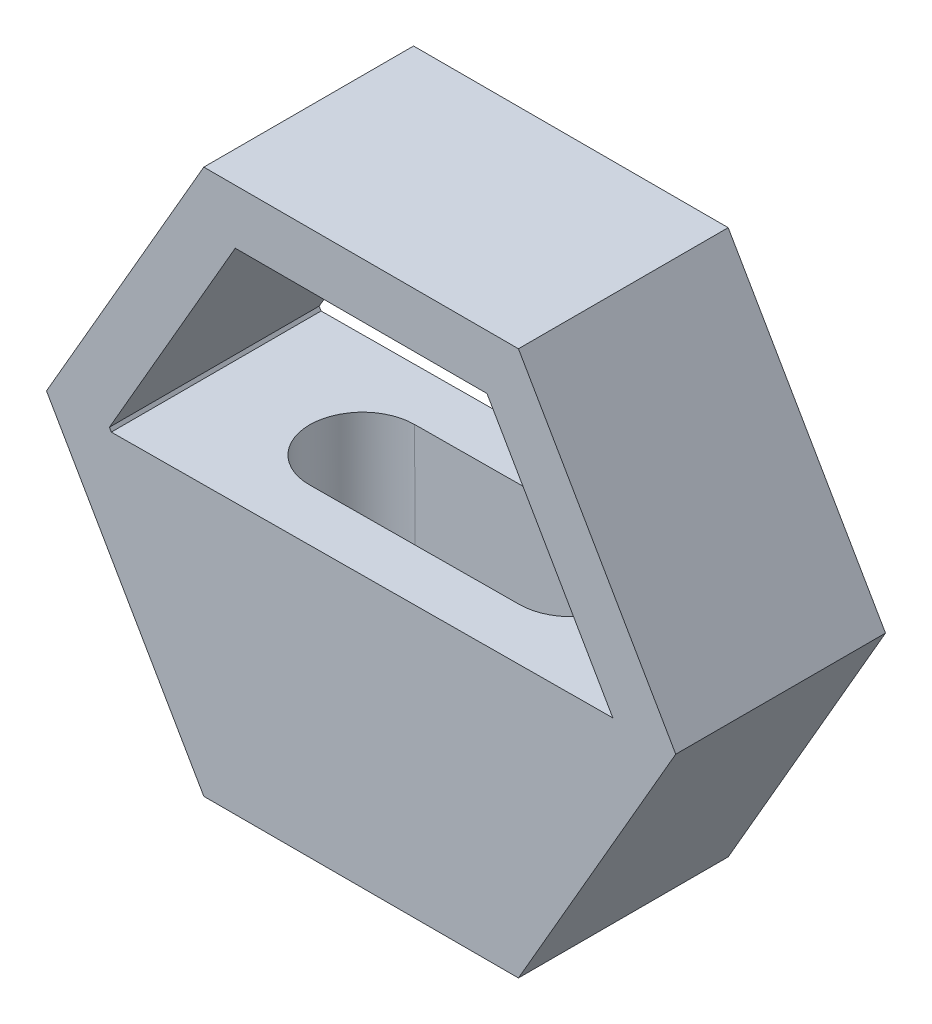
ISO-10303-21;
HEADER;
FILE_DESCRIPTION(('STEP AP214'),'2;1');
FILE_NAME('part.step','',(''),(''),'','','');
FILE_SCHEMA(('AUTOMOTIVE_DESIGN { 1 0 10303 214 1 1 1 1 }'));
ENDSEC;
DATA;
#1=APPLICATION_CONTEXT('core data for automotive mechanical design processes');
#2=APPLICATION_PROTOCOL_DEFINITION('international standard','automotive_design',2000,#1);
#3=PRODUCT_CONTEXT('',#1,'mechanical');
#4=PRODUCT('Part','Part','',(#3));
#5=PRODUCT_RELATED_PRODUCT_CATEGORY('part','',(#4));
#6=PRODUCT_DEFINITION_FORMATION('','',#4);
#7=PRODUCT_DEFINITION_CONTEXT('part definition',#1,'design');
#8=PRODUCT_DEFINITION('design','',#6,#7);
#9=PRODUCT_DEFINITION_SHAPE('','',#8);
#10=(LENGTH_UNIT() NAMED_UNIT(*) SI_UNIT(.MILLI.,.METRE.));
#11=(NAMED_UNIT(*) PLANE_ANGLE_UNIT() SI_UNIT($,.RADIAN.));
#12=(NAMED_UNIT(*) SI_UNIT($,.STERADIAN.) SOLID_ANGLE_UNIT());
#13=UNCERTAINTY_MEASURE_WITH_UNIT(LENGTH_MEASURE(1.E-05),#10,'distance_accuracy_value','');
#14=(GEOMETRIC_REPRESENTATION_CONTEXT(3) GLOBAL_UNCERTAINTY_ASSIGNED_CONTEXT((#13)) GLOBAL_UNIT_ASSIGNED_CONTEXT((#10,
#11,#12)) REPRESENTATION_CONTEXT('',''));
#15=CARTESIAN_POINT('',(0.,0.,0.));
#16=DIRECTION('',(0.,0.,1.));
#17=DIRECTION('',(1.,0.,0.));
#18=AXIS2_PLACEMENT_3D('',#15,#16,#17);
#19=CARTESIAN_POINT('',(75.,-129.903810567666,-100.));
#20=DIRECTION('',(0.866025403784439,-0.5,0.));
#21=DIRECTION('',(0.5,0.866025403784439,0.));
#22=AXIS2_PLACEMENT_3D('',#19,#20,#21);
#23=PLANE('',#22);
#24=DIRECTION('',(0.5,0.866025403784439,0.));
#25=VECTOR('',#24,1.);
#26=CARTESIAN_POINT('',(75.,-129.903810567666,0.));
#27=LINE('',#26,#25);
#28=CARTESIAN_POINT('',(75.,-129.903810567666,0.));
#29=VERTEX_POINT('',#28);
#30=CARTESIAN_POINT('',(150.,0.,0.));
#31=VERTEX_POINT('',#30);
#32=EDGE_CURVE('E208',#29,#31,#27,.T.);
#33=ORIENTED_EDGE('',*,*,#32,.F.);
#34=DIRECTION('',(0.,0.,1.));
#35=VECTOR('',#34,1.);
#36=CARTESIAN_POINT('',(75.,-129.903810567666,-100.));
#37=LINE('',#36,#35);
#38=CARTESIAN_POINT('',(75.,-129.903810567666,-100.));
#39=VERTEX_POINT('',#38);
#40=EDGE_CURVE('E11',#39,#29,#37,.T.);
#41=ORIENTED_EDGE('',*,*,#40,.F.);
#42=DIRECTION('',(0.5,0.866025403784439,0.));
#43=VECTOR('',#42,1.);
#44=CARTESIAN_POINT('',(75.,-129.903810567666,-100.));
#45=LINE('',#44,#43);
#46=CARTESIAN_POINT('',(150.,0.,-100.));
#47=VERTEX_POINT('',#46);
#48=EDGE_CURVE('E217',#39,#47,#45,.T.);
#49=ORIENTED_EDGE('',*,*,#48,.T.);
#50=DIRECTION('',(0.,0.,1.));
#51=VECTOR('',#50,1.);
#52=CARTESIAN_POINT('',(150.,0.,-100.));
#53=LINE('',#52,#51);
#54=EDGE_CURVE('E36',#47,#31,#53,.T.);
#55=ORIENTED_EDGE('',*,*,#54,.T.);
#56=EDGE_LOOP('',(#33,#41,#49,#55));
#57=FACE_BOUND('',#56,.T.);
#58=ADVANCED_FACE('F33',(#57),#23,.T.);
#59=CARTESIAN_POINT('',(-75.0000000000001,-129.903810567666,-100.));
#60=DIRECTION('',(0.,-1.,0.));
#61=DIRECTION('',(1.,0.,0.));
#62=AXIS2_PLACEMENT_3D('',#59,#60,#61);
#63=PLANE('',#62);
#64=DIRECTION('',(1.,0.,0.));
#65=VECTOR('',#64,1.);
#66=CARTESIAN_POINT('',(-75.0000000000001,-129.903810567666,0.));
#67=LINE('',#66,#65);
#68=CARTESIAN_POINT('',(-75.0000000000001,-129.903810567666,0.));
#69=VERTEX_POINT('',#68);
#70=EDGE_CURVE('E221',#69,#29,#67,.T.);
#71=ORIENTED_EDGE('',*,*,#70,.F.);
#72=DIRECTION('',(0.,0.,1.));
#73=VECTOR('',#72,1.);
#74=CARTESIAN_POINT('',(-75.0000000000001,-129.903810567666,-100.));
#75=LINE('',#74,#73);
#76=CARTESIAN_POINT('',(-75.0000000000001,-129.903810567666,-100.));
#77=VERTEX_POINT('',#76);
#78=EDGE_CURVE('E41',#77,#69,#75,.T.);
#79=ORIENTED_EDGE('',*,*,#78,.F.);
#80=DIRECTION('',(1.,0.,0.));
#81=VECTOR('',#80,1.);
#82=CARTESIAN_POINT('',(-75.0000000000001,-129.903810567666,-100.));
#83=LINE('',#82,#81);
#84=EDGE_CURVE('E233',#77,#39,#83,.T.);
#85=ORIENTED_EDGE('',*,*,#84,.T.);
#86=ORIENTED_EDGE('',*,*,#40,.T.);
#87=EDGE_LOOP('',(#71,#79,#85,#86));
#88=FACE_BOUND('',#87,.T.);
#89=ADVANCED_FACE('F270',(#88),#63,.T.);
#90=CARTESIAN_POINT('',(-150.,0.,-100.));
#91=DIRECTION('',(-0.866025403784439,-0.5,0.));
#92=DIRECTION('',(0.5,-0.866025403784439,0.));
#93=AXIS2_PLACEMENT_3D('',#90,#91,#92);
#94=PLANE('',#93);
#95=DIRECTION('',(0.5,-0.866025403784439,0.));
#96=VECTOR('',#95,1.);
#97=CARTESIAN_POINT('',(-150.,0.,0.));
#98=LINE('',#97,#96);
#99=CARTESIAN_POINT('',(-150.,0.,0.));
#100=VERTEX_POINT('',#99);
#101=EDGE_CURVE('E247',#100,#69,#98,.T.);
#102=ORIENTED_EDGE('',*,*,#101,.F.);
#103=DIRECTION('',(0.,0.,1.));
#104=VECTOR('',#103,1.);
#105=CARTESIAN_POINT('',(-150.,0.,-100.));
#106=LINE('',#105,#104);
#107=CARTESIAN_POINT('',(-150.,0.,-100.));
#108=VERTEX_POINT('',#107);
#109=EDGE_CURVE('E253',#108,#100,#106,.T.);
#110=ORIENTED_EDGE('',*,*,#109,.F.);
#111=DIRECTION('',(0.5,-0.866025403784439,0.));
#112=VECTOR('',#111,1.);
#113=CARTESIAN_POINT('',(-150.,0.,-100.));
#114=LINE('',#113,#112);
#115=EDGE_CURVE('E230',#108,#77,#114,.T.);
#116=ORIENTED_EDGE('',*,*,#115,.T.);
#117=ORIENTED_EDGE('',*,*,#78,.T.);
#118=EDGE_LOOP('',(#102,#110,#116,#117));
#119=FACE_BOUND('',#118,.T.);
#120=ADVANCED_FACE('F283',(#119),#94,.T.);
#121=CARTESIAN_POINT('',(-75.,129.903810567666,-100.));
#122=DIRECTION('',(-0.866025403784439,0.5,0.));
#123=DIRECTION('',(-0.5,-0.866025403784439,0.));
#124=AXIS2_PLACEMENT_3D('',#121,#122,#123);
#125=PLANE('',#124);
#126=DIRECTION('',(-0.5,-0.866025403784439,0.));
#127=VECTOR('',#126,1.);
#128=CARTESIAN_POINT('',(-75.,129.903810567666,0.));
#129=LINE('',#128,#127);
#130=CARTESIAN_POINT('',(-75.,129.903810567666,0.));
#131=VERTEX_POINT('',#130);
#132=EDGE_CURVE('E244',#131,#100,#129,.T.);
#133=ORIENTED_EDGE('',*,*,#132,.F.);
#134=DIRECTION('',(0.,0.,1.));
#135=VECTOR('',#134,1.);
#136=CARTESIAN_POINT('',(-75.,129.903810567666,-100.));
#137=LINE('',#136,#135);
#138=CARTESIAN_POINT('',(-75.,129.903810567666,-100.));
#139=VERTEX_POINT('',#138);
#140=EDGE_CURVE('E255',#139,#131,#137,.T.);
#141=ORIENTED_EDGE('',*,*,#140,.F.);
#142=DIRECTION('',(-0.5,-0.866025403784439,0.));
#143=VECTOR('',#142,1.);
#144=CARTESIAN_POINT('',(-75.,129.903810567666,-100.));
#145=LINE('',#144,#143);
#146=EDGE_CURVE('E227',#139,#108,#145,.T.);
#147=ORIENTED_EDGE('',*,*,#146,.T.);
#148=ORIENTED_EDGE('',*,*,#109,.T.);
#149=EDGE_LOOP('',(#133,#141,#147,#148));
#150=FACE_BOUND('',#149,.T.);
#151=ADVANCED_FACE('F281',(#150),#125,.T.);
#152=CARTESIAN_POINT('',(75.,129.903810567666,-100.));
#153=DIRECTION('',(0.,1.,0.));
#154=DIRECTION('',(0.,0.,1.));
#155=AXIS2_PLACEMENT_3D('',#152,#153,#154);
#156=PLANE('',#155);
#157=DIRECTION('',(-1.,0.,0.));
#158=VECTOR('',#157,1.);
#159=CARTESIAN_POINT('',(75.,129.903810567666,0.));
#160=LINE('',#159,#158);
#161=CARTESIAN_POINT('',(75.,129.903810567666,0.));
#162=VERTEX_POINT('',#161);
#163=EDGE_CURVE('E241',#162,#131,#160,.T.);
#164=ORIENTED_EDGE('',*,*,#163,.F.);
#165=DIRECTION('',(0.,0.,1.));
#166=VECTOR('',#165,1.);
#167=CARTESIAN_POINT('',(75.,129.903810567666,-100.));
#168=LINE('',#167,#166);
#169=CARTESIAN_POINT('',(75.,129.903810567666,-100.));
#170=VERTEX_POINT('',#169);
#171=EDGE_CURVE('E256',#170,#162,#168,.T.);
#172=ORIENTED_EDGE('',*,*,#171,.F.);
#173=DIRECTION('',(-1.,0.,0.));
#174=VECTOR('',#173,1.);
#175=CARTESIAN_POINT('',(75.,129.903810567666,-100.));
#176=LINE('',#175,#174);
#177=EDGE_CURVE('E224',#170,#139,#176,.T.);
#178=ORIENTED_EDGE('',*,*,#177,.T.);
#179=ORIENTED_EDGE('',*,*,#140,.T.);
#180=EDGE_LOOP('',(#164,#172,#178,#179));
#181=FACE_BOUND('',#180,.T.);
#182=ADVANCED_FACE('F278',(#181),#156,.T.);
#183=CARTESIAN_POINT('',(150.,0.,-100.));
#184=DIRECTION('',(0.866025403784438,0.5,0.));
#185=DIRECTION('',(-0.5,0.866025403784439,0.));
#186=AXIS2_PLACEMENT_3D('',#183,#184,#185);
#187=PLANE('',#186);
#188=DIRECTION('',(-0.5,0.866025403784438,0.));
#189=VECTOR('',#188,1.);
#190=CARTESIAN_POINT('',(150.,0.,0.));
#191=LINE('',#190,#189);
#192=EDGE_CURVE('E238',#31,#162,#191,.T.);
#193=ORIENTED_EDGE('',*,*,#192,.F.);
#194=ORIENTED_EDGE('',*,*,#54,.F.);
#195=DIRECTION('',(-0.5,0.866025403784438,0.));
#196=VECTOR('',#195,1.);
#197=CARTESIAN_POINT('',(150.,0.,-100.));
#198=LINE('',#197,#196);
#199=EDGE_CURVE('E220',#47,#170,#198,.T.);
#200=ORIENTED_EDGE('',*,*,#199,.T.);
#201=ORIENTED_EDGE('',*,*,#171,.T.);
#202=EDGE_LOOP('',(#193,#194,#200,#201));
#203=FACE_BOUND('',#202,.T.);
#204=ADVANCED_FACE('F264',(#203),#187,.T.);
#205=CARTESIAN_POINT('',(0.,0.,-100.));
#206=DIRECTION('',(0.,0.,1.));
#207=DIRECTION('',(1.,0.,0.));
#208=AXIS2_PLACEMENT_3D('',#205,#206,#207);
#209=PLANE('',#208);
#210=DIRECTION('',(-1.,0.,0.));
#211=VECTOR('',#210,1.);
#212=CARTESIAN_POINT('',(0.,103.923048454133,-100.));
#213=LINE('',#212,#211);
#214=CARTESIAN_POINT('',(60.,103.923048454133,-100.));
#215=VERTEX_POINT('',#214);
#216=CARTESIAN_POINT('',(-60.,103.923048454133,-100.));
#217=VERTEX_POINT('',#216);
#218=EDGE_CURVE('E190',#215,#217,#213,.T.);
#219=ORIENTED_EDGE('',*,*,#218,.T.);
#220=DIRECTION('',(-0.5,-0.866025403784439,0.));
#221=VECTOR('',#220,1.);
#222=CARTESIAN_POINT('',(-90.0000000000001,51.9615242270663,-100.));
#223=LINE('',#222,#221);
#224=CARTESIAN_POINT('',(-120.,0.,-100.));
#225=VERTEX_POINT('',#224);
#226=EDGE_CURVE('E179',#217,#225,#223,.T.);
#227=ORIENTED_EDGE('',*,*,#226,.T.);
#228=DIRECTION('',(0.5,-0.866025403784439,0.));
#229=VECTOR('',#228,1.);
#230=CARTESIAN_POINT('',(-90.,-51.9615242270664,-100.));
#231=LINE('',#230,#229);
#232=CARTESIAN_POINT('',(-119.097636783105,-1.56293893854325,-100.));
#233=VERTEX_POINT('',#232);
#234=EDGE_CURVE('E182',#225,#233,#231,.T.);
#235=ORIENTED_EDGE('',*,*,#234,.T.);
#236=DIRECTION('',(0.99997863565701,0.00653668337507449,0.));
#237=VECTOR('',#236,1.);
#238=CARTESIAN_POINT('',(0.00512738754551685,-0.784385246775434,-100.));
#239=LINE('',#238,#237);
#240=CARTESIAN_POINT('',(120.,0.,-100.));
#241=VERTEX_POINT('',#240);
#242=EDGE_CURVE('E57',#233,#241,#239,.T.);
#243=ORIENTED_EDGE('',*,*,#242,.T.);
#244=DIRECTION('',(-0.5,0.866025403784439,0.));
#245=VECTOR('',#244,1.);
#246=CARTESIAN_POINT('',(90.,51.9615242270663,-100.));
#247=LINE('',#246,#245);
#248=EDGE_CURVE('E187',#241,#215,#247,.T.);
#249=ORIENTED_EDGE('',*,*,#248,.T.);
#250=EDGE_LOOP('',(#219,#227,#235,#243,#249));
#251=FACE_BOUND('',#250,.T.);
#252=ORIENTED_EDGE('',*,*,#48,.F.);
#253=ORIENTED_EDGE('',*,*,#84,.F.);
#254=ORIENTED_EDGE('',*,*,#115,.F.);
#255=ORIENTED_EDGE('',*,*,#146,.F.);
#256=ORIENTED_EDGE('',*,*,#177,.F.);
#257=ORIENTED_EDGE('',*,*,#199,.F.);
#258=EDGE_LOOP('',(#252,#253,#254,#255,#256,#257));
#259=FACE_BOUND('',#258,.T.);
#260=ADVANCED_FACE('F273',(#251,#259),#209,.F.);
#261=CARTESIAN_POINT('',(0.,0.,0.));
#262=DIRECTION('',(0.,0.,1.));
#263=DIRECTION('',(1.,0.,0.));
#264=AXIS2_PLACEMENT_3D('',#261,#262,#263);
#265=PLANE('',#264);
#266=DIRECTION('',(-0.5,-0.866025403784439,0.));
#267=VECTOR('',#266,1.);
#268=CARTESIAN_POINT('',(-90.0000000000001,51.9615242270663,0.));
#269=LINE('',#268,#267);
#270=CARTESIAN_POINT('',(-60.,103.923048454133,0.));
#271=VERTEX_POINT('',#270);
#272=CARTESIAN_POINT('',(-120.,0.,0.));
#273=VERTEX_POINT('',#272);
#274=EDGE_CURVE('E175',#271,#273,#269,.T.);
#275=ORIENTED_EDGE('',*,*,#274,.F.);
#276=DIRECTION('',(-1.,0.,0.));
#277=VECTOR('',#276,1.);
#278=CARTESIAN_POINT('',(0.,103.923048454133,0.));
#279=LINE('',#278,#277);
#280=CARTESIAN_POINT('',(60.,103.923048454133,0.));
#281=VERTEX_POINT('',#280);
#282=EDGE_CURVE('E183',#281,#271,#279,.T.);
#283=ORIENTED_EDGE('',*,*,#282,.F.);
#284=DIRECTION('',(-0.5,0.866025403784439,0.));
#285=VECTOR('',#284,1.);
#286=CARTESIAN_POINT('',(90.,51.9615242270663,0.));
#287=LINE('',#286,#285);
#288=CARTESIAN_POINT('',(120.,0.,0.));
#289=VERTEX_POINT('',#288);
#290=EDGE_CURVE('E201',#289,#281,#287,.T.);
#291=ORIENTED_EDGE('',*,*,#290,.F.);
#292=DIRECTION('',(0.99997863565701,0.00653668337507449,0.));
#293=VECTOR('',#292,1.);
#294=CARTESIAN_POINT('',(0.00512738754551685,-0.784385246775434,0.));
#295=LINE('',#294,#293);
#296=CARTESIAN_POINT('',(-119.097636783105,-1.56293893854325,0.));
#297=VERTEX_POINT('',#296);
#298=EDGE_CURVE('E198',#297,#289,#295,.T.);
#299=ORIENTED_EDGE('',*,*,#298,.F.);
#300=DIRECTION('',(0.5,-0.866025403784439,0.));
#301=VECTOR('',#300,1.);
#302=CARTESIAN_POINT('',(-90.,-51.9615242270664,0.));
#303=LINE('',#302,#301);
#304=EDGE_CURVE('E195',#273,#297,#303,.T.);
#305=ORIENTED_EDGE('',*,*,#304,.F.);
#306=EDGE_LOOP('',(#275,#283,#291,#299,#305));
#307=FACE_BOUND('',#306,.T.);
#308=ORIENTED_EDGE('',*,*,#32,.T.);
#309=ORIENTED_EDGE('',*,*,#192,.T.);
#310=ORIENTED_EDGE('',*,*,#163,.T.);
#311=ORIENTED_EDGE('',*,*,#132,.T.);
#312=ORIENTED_EDGE('',*,*,#101,.T.);
#313=ORIENTED_EDGE('',*,*,#70,.T.);
#314=EDGE_LOOP('',(#308,#309,#310,#311,#312,#313));
#315=FACE_BOUND('',#314,.T.);
#316=ADVANCED_FACE('F266',(#307,#315),#265,.T.);
#317=CARTESIAN_POINT('',(-90.0000000000001,51.9615242270663,-100.));
#318=DIRECTION('',(-0.866025403784439,0.5,0.));
#319=DIRECTION('',(-0.5,-0.866025403784439,0.));
#320=AXIS2_PLACEMENT_3D('',#317,#318,#319);
#321=PLANE('',#320);
#322=ORIENTED_EDGE('',*,*,#274,.T.);
#323=DIRECTION('',(0.,0.,1.));
#324=VECTOR('',#323,1.);
#325=CARTESIAN_POINT('',(-120.,0.,-100.));
#326=LINE('',#325,#324);
#327=EDGE_CURVE('E193',#225,#273,#326,.T.);
#328=ORIENTED_EDGE('',*,*,#327,.F.);
#329=ORIENTED_EDGE('',*,*,#226,.F.);
#330=DIRECTION('',(0.,0.,1.));
#331=VECTOR('',#330,1.);
#332=CARTESIAN_POINT('',(-60.,103.923048454133,-100.));
#333=LINE('',#332,#331);
#334=EDGE_CURVE('E206',#217,#271,#333,.T.);
#335=ORIENTED_EDGE('',*,*,#334,.T.);
#336=EDGE_LOOP('',(#322,#328,#329,#335));
#337=FACE_BOUND('',#336,.T.);
#338=ADVANCED_FACE('F342',(#337),#321,.F.);
#339=CARTESIAN_POINT('',(0.,103.923048454133,-100.));
#340=DIRECTION('',(0.,1.,0.));
#341=DIRECTION('',(0.,0.,1.));
#342=AXIS2_PLACEMENT_3D('',#339,#340,#341);
#343=PLANE('',#342);
#344=ORIENTED_EDGE('',*,*,#282,.T.);
#345=ORIENTED_EDGE('',*,*,#334,.F.);
#346=ORIENTED_EDGE('',*,*,#218,.F.);
#347=DIRECTION('',(0.,0.,1.));
#348=VECTOR('',#347,1.);
#349=CARTESIAN_POINT('',(60.,103.923048454133,-100.));
#350=LINE('',#349,#348);
#351=EDGE_CURVE('E209',#215,#281,#350,.T.);
#352=ORIENTED_EDGE('',*,*,#351,.T.);
#353=EDGE_LOOP('',(#344,#345,#346,#352));
#354=FACE_BOUND('',#353,.T.);
#355=ADVANCED_FACE('F352',(#354),#343,.F.);
#356=CARTESIAN_POINT('',(90.,51.9615242270663,-100.));
#357=DIRECTION('',(0.866025403784439,0.5,0.));
#358=DIRECTION('',(-0.5,0.866025403784439,0.));
#359=AXIS2_PLACEMENT_3D('',#356,#357,#358);
#360=PLANE('',#359);
#361=ORIENTED_EDGE('',*,*,#290,.T.);
#362=ORIENTED_EDGE('',*,*,#351,.F.);
#363=ORIENTED_EDGE('',*,*,#248,.F.);
#364=DIRECTION('',(0.,0.,1.));
#365=VECTOR('',#364,1.);
#366=CARTESIAN_POINT('',(120.,0.,-100.));
#367=LINE('',#366,#365);
#368=EDGE_CURVE('E211',#241,#289,#367,.T.);
#369=ORIENTED_EDGE('',*,*,#368,.T.);
#370=EDGE_LOOP('',(#361,#362,#363,#369));
#371=FACE_BOUND('',#370,.T.);
#372=ADVANCED_FACE('F362',(#371),#360,.F.);
#373=CARTESIAN_POINT('',(0.00512738754551685,-0.784385246775434,-100.));
#374=DIRECTION('',(0.0065366833750745,-0.99997863565701,0.));
#375=DIRECTION('',(0.99997863565701,0.0065366833750745,0.));
#376=AXIS2_PLACEMENT_3D('',#373,#374,#375);
#377=PLANE('',#376);
#378=CARTESIAN_POINT('',(-49.5477501744031,-1.10830363802534,-50.));
#379=DIRECTION('',(-0.0065366833750745,0.99997863565701,0.));
#380=DIRECTION('',(-0.99997863565701,-0.0065366833750745,0.));
#381=AXIS2_PLACEMENT_3D('',#378,#379,#380);
#382=CIRCLE('',#381,25.);
#383=CARTESIAN_POINT('',(-49.5477501744031,-1.10830363802533,-75.));
#384=VERTEX_POINT('',#383);
#385=CARTESIAN_POINT('',(-49.5477501744031,-1.10830363802534,-25.));
#386=VERTEX_POINT('',#385);
#387=EDGE_CURVE('E169',#384,#386,#382,.T.);
#388=ORIENTED_EDGE('',*,*,#387,.F.);
#389=DIRECTION('',(-0.99997863565701,-0.0065366833750745,0.));
#390=VECTOR('',#389,1.);
#391=CARTESIAN_POINT('',(0.00512738754551686,-0.784385246775435,-75.));
#392=LINE('',#391,#390);
#393=CARTESIAN_POINT('',(50.4501133912979,-0.454635300517888,-75.));
#394=VERTEX_POINT('',#393);
#395=EDGE_CURVE('E49',#394,#384,#392,.T.);
#396=ORIENTED_EDGE('',*,*,#395,.F.);
#397=CARTESIAN_POINT('',(50.4501133912979,-0.454635300517888,-50.));
#398=DIRECTION('',(-0.0065366833750745,0.99997863565701,0.));
#399=DIRECTION('',(-0.99997863565701,-0.0065366833750745,0.));
#400=AXIS2_PLACEMENT_3D('',#397,#398,#399);
#401=CIRCLE('',#400,25.);
#402=CARTESIAN_POINT('',(50.4501133912979,-0.454635300517888,-25.));
#403=VERTEX_POINT('',#402);
#404=EDGE_CURVE('E160',#403,#394,#401,.T.);
#405=ORIENTED_EDGE('',*,*,#404,.F.);
#406=DIRECTION('',(-0.99997863565701,-0.0065366833750745,0.));
#407=VECTOR('',#406,1.);
#408=CARTESIAN_POINT('',(0.00512738754551339,-0.784385246775434,-25.));
#409=LINE('',#408,#407);
#410=EDGE_CURVE('E163',#403,#386,#409,.T.);
#411=ORIENTED_EDGE('',*,*,#410,.T.);
#412=EDGE_LOOP('',(#388,#396,#405,#411));
#413=FACE_BOUND('',#412,.T.);
#414=ORIENTED_EDGE('',*,*,#298,.T.);
#415=ORIENTED_EDGE('',*,*,#368,.F.);
#416=ORIENTED_EDGE('',*,*,#242,.F.);
#417=DIRECTION('',(0.,0.,1.));
#418=VECTOR('',#417,1.);
#419=CARTESIAN_POINT('',(-119.097636783105,-1.56293893854325,-100.));
#420=LINE('',#419,#418);
#421=EDGE_CURVE('E213',#233,#297,#420,.T.);
#422=ORIENTED_EDGE('',*,*,#421,.T.);
#423=EDGE_LOOP('',(#414,#415,#416,#422));
#424=FACE_BOUND('',#423,.T.);
#425=ADVANCED_FACE('F372',(#413,#424),#377,.F.);
#426=CARTESIAN_POINT('',(-90.,-51.9615242270664,-100.));
#427=DIRECTION('',(-0.866025403784439,-0.5,0.));
#428=DIRECTION('',(0.5,-0.866025403784439,0.));
#429=AXIS2_PLACEMENT_3D('',#426,#427,#428);
#430=PLANE('',#429);
#431=ORIENTED_EDGE('',*,*,#304,.T.);
#432=ORIENTED_EDGE('',*,*,#421,.F.);
#433=ORIENTED_EDGE('',*,*,#234,.F.);
#434=ORIENTED_EDGE('',*,*,#327,.T.);
#435=EDGE_LOOP('',(#431,#432,#433,#434));
#436=FACE_BOUND('',#435,.T.);
#437=ADVANCED_FACE('F380',(#436),#430,.F.);
#438=CARTESIAN_POINT('',(0.658795725052967,-100.782248812476,-75.));
#439=DIRECTION('',(0.,0.,-1.));
#440=DIRECTION('',(-1.,0.,0.));
#441=AXIS2_PLACEMENT_3D('',#438,#439,#440);
#442=PLANE('',#441);
#443=ORIENTED_EDGE('',*,*,#395,.T.);
#444=DIRECTION('',(-0.0065366833750745,0.99997863565701,0.));
#445=VECTOR('',#444,1.);
#446=CARTESIAN_POINT('',(-48.8940818368956,-101.106167203726,-75.));
#447=LINE('',#446,#445);
#448=CARTESIAN_POINT('',(-48.8940818368956,-101.106167203726,-75.));
#449=VERTEX_POINT('',#448);
#450=EDGE_CURVE('E138',#449,#384,#447,.T.);
#451=ORIENTED_EDGE('',*,*,#450,.F.);
#452=DIRECTION('',(-0.99997863565701,-0.0065366833750745,0.));
#453=VECTOR('',#452,1.);
#454=CARTESIAN_POINT('',(0.658795725052967,-100.782248812476,-75.));
#455=LINE('',#454,#453);
#456=CARTESIAN_POINT('',(51.1037817288053,-100.452498866219,-75.));
#457=VERTEX_POINT('',#456);
#458=EDGE_CURVE('E142',#457,#449,#455,.T.);
#459=ORIENTED_EDGE('',*,*,#458,.F.);
#460=DIRECTION('',(-0.0065366833750745,0.99997863565701,0.));
#461=VECTOR('',#460,1.);
#462=CARTESIAN_POINT('',(51.1037817288053,-100.452498866219,-75.));
#463=LINE('',#462,#461);
#464=EDGE_CURVE('E173',#457,#394,#463,.T.);
#465=ORIENTED_EDGE('',*,*,#464,.T.);
#466=EDGE_LOOP('',(#443,#451,#459,#465));
#467=FACE_BOUND('',#466,.T.);
#468=ADVANCED_FACE('F140',(#467),#442,.F.);
#469=CARTESIAN_POINT('',(51.1037817288053,-100.452498866219,-50.));
#470=DIRECTION('',(-0.0065366833750745,0.99997863565701,0.));
#471=DIRECTION('',(-0.99997863565701,-0.0065366833750745,0.));
#472=AXIS2_PLACEMENT_3D('',#469,#470,#471);
#473=CYLINDRICAL_SURFACE('',#472,25.);
#474=ORIENTED_EDGE('',*,*,#404,.T.);
#475=ORIENTED_EDGE('',*,*,#464,.F.);
#476=CARTESIAN_POINT('',(51.1037817288053,-100.452498866219,-50.));
#477=DIRECTION('',(-0.0065366833750745,0.99997863565701,0.));
#478=DIRECTION('',(-0.99997863565701,-0.0065366833750745,0.));
#479=AXIS2_PLACEMENT_3D('',#476,#477,#478);
#480=CIRCLE('',#479,25.);
#481=CARTESIAN_POINT('',(51.1037817288053,-100.452498866219,-25.));
#482=VERTEX_POINT('',#481);
#483=EDGE_CURVE('E148',#482,#457,#480,.T.);
#484=ORIENTED_EDGE('',*,*,#483,.F.);
#485=DIRECTION('',(-0.0065366833750745,0.99997863565701,0.));
#486=VECTOR('',#485,1.);
#487=CARTESIAN_POINT('',(51.1037817288053,-100.452498866219,-25.));
#488=LINE('',#487,#486);
#489=EDGE_CURVE('E176',#482,#403,#488,.T.);
#490=ORIENTED_EDGE('',*,*,#489,.T.);
#491=EDGE_LOOP('',(#474,#475,#484,#490));
#492=FACE_BOUND('',#491,.T.);
#493=ADVANCED_FACE('F402',(#492),#473,.F.);
#494=CARTESIAN_POINT('',(0.658795725052963,-100.782248812476,-25.));
#495=DIRECTION('',(0.,0.,-1.));
#496=DIRECTION('',(-1.,0.,0.));
#497=AXIS2_PLACEMENT_3D('',#494,#495,#496);
#498=PLANE('',#497);
#499=ORIENTED_EDGE('',*,*,#410,.F.);
#500=ORIENTED_EDGE('',*,*,#489,.F.);
#501=DIRECTION('',(-0.99997863565701,-0.0065366833750745,0.));
#502=VECTOR('',#501,1.);
#503=CARTESIAN_POINT('',(0.658795725052963,-100.782248812476,-25.));
#504=LINE('',#503,#502);
#505=CARTESIAN_POINT('',(-48.8940818368956,-101.106167203726,-25.));
#506=VERTEX_POINT('',#505);
#507=EDGE_CURVE('E156',#482,#506,#504,.T.);
#508=ORIENTED_EDGE('',*,*,#507,.T.);
#509=DIRECTION('',(-0.0065366833750745,0.99997863565701,0.));
#510=VECTOR('',#509,1.);
#511=CARTESIAN_POINT('',(-48.8940818368956,-101.106167203726,-25.));
#512=LINE('',#511,#510);
#513=EDGE_CURVE('E147',#506,#386,#512,.T.);
#514=ORIENTED_EDGE('',*,*,#513,.T.);
#515=EDGE_LOOP('',(#499,#500,#508,#514));
#516=FACE_BOUND('',#515,.T.);
#517=ADVANCED_FACE('F411',(#516),#498,.T.);
#518=CARTESIAN_POINT('',(-48.8940818368956,-101.106167203726,-50.));
#519=DIRECTION('',(-0.0065366833750745,0.99997863565701,0.));
#520=DIRECTION('',(-0.99997863565701,-0.0065366833750745,0.));
#521=AXIS2_PLACEMENT_3D('',#518,#519,#520);
#522=CYLINDRICAL_SURFACE('',#521,25.);
#523=ORIENTED_EDGE('',*,*,#387,.T.);
#524=ORIENTED_EDGE('',*,*,#513,.F.);
#525=CARTESIAN_POINT('',(-48.8940818368956,-101.106167203726,-50.));
#526=DIRECTION('',(-0.0065366833750745,0.99997863565701,0.));
#527=DIRECTION('',(-0.99997863565701,-0.0065366833750745,0.));
#528=AXIS2_PLACEMENT_3D('',#525,#526,#527);
#529=CIRCLE('',#528,25.);
#530=EDGE_CURVE('E152',#449,#506,#529,.T.);
#531=ORIENTED_EDGE('',*,*,#530,.F.);
#532=ORIENTED_EDGE('',*,*,#450,.T.);
#533=EDGE_LOOP('',(#523,#524,#531,#532));
#534=FACE_BOUND('',#533,.T.);
#535=ADVANCED_FACE('F153',(#534),#522,.F.);
#536=CARTESIAN_POINT('',(0.658795725052967,-100.782248812476,0.));
#537=DIRECTION('',(-0.0065366833750745,0.99997863565701,0.));
#538=DIRECTION('',(-0.99997863565701,-0.0065366833750745,0.));
#539=AXIS2_PLACEMENT_3D('',#536,#537,#538);
#540=PLANE('',#539);
#541=ORIENTED_EDGE('',*,*,#458,.T.);
#542=ORIENTED_EDGE('',*,*,#530,.T.);
#543=ORIENTED_EDGE('',*,*,#507,.F.);
#544=ORIENTED_EDGE('',*,*,#483,.T.);
#545=EDGE_LOOP('',(#541,#542,#543,#544));
#546=FACE_BOUND('',#545,.T.);
#547=ADVANCED_FACE('F158',(#546),#540,.T.);
#548=CLOSED_SHELL('',(#58,#89,#120,#151,#182,#204,#260,#316,#338,#355,#372,#425,#437,#468,#493,
#517,#535,#547));
#549=MANIFOLD_SOLID_BREP('B2',#548);
#550=ADVANCED_BREP_SHAPE_REPRESENTATION('',(#18,#549),#14);
#551=SHAPE_DEFINITION_REPRESENTATION(#9,#550);
ENDSEC;
END-ISO-10303-21;
